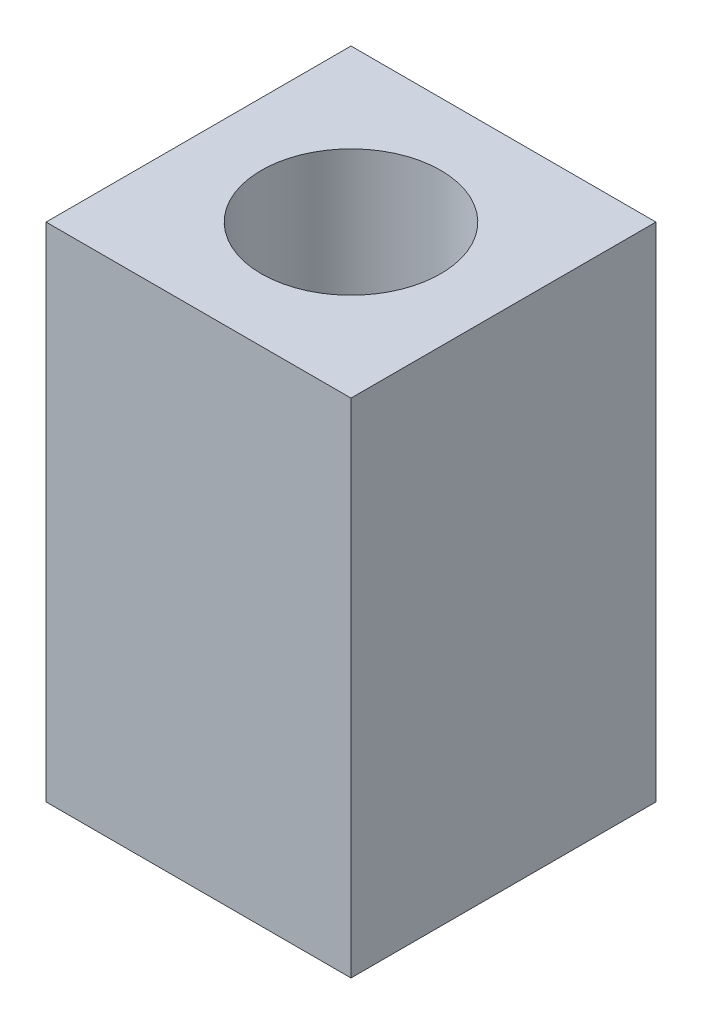
ISO-10303-21;
HEADER;
FILE_DESCRIPTION(('STEP AP214'),'2;1');
FILE_NAME('part.step','',(''),(''),'','','');
FILE_SCHEMA(('AUTOMOTIVE_DESIGN { 1 0 10303 214 1 1 1 1 }'));
ENDSEC;
DATA;
#1=APPLICATION_CONTEXT('core data for automotive mechanical design processes');
#2=APPLICATION_PROTOCOL_DEFINITION('international standard','automotive_design',2000,#1);
#3=PRODUCT_CONTEXT('',#1,'mechanical');
#4=PRODUCT('Part','Part','',(#3));
#5=PRODUCT_RELATED_PRODUCT_CATEGORY('part','',(#4));
#6=PRODUCT_DEFINITION_FORMATION('','',#4);
#7=PRODUCT_DEFINITION_CONTEXT('part definition',#1,'design');
#8=PRODUCT_DEFINITION('design','',#6,#7);
#9=PRODUCT_DEFINITION_SHAPE('','',#8);
#10=(LENGTH_UNIT() NAMED_UNIT(*) SI_UNIT(.MILLI.,.METRE.));
#11=(NAMED_UNIT(*) PLANE_ANGLE_UNIT() SI_UNIT($,.RADIAN.));
#12=(NAMED_UNIT(*) SI_UNIT($,.STERADIAN.) SOLID_ANGLE_UNIT());
#13=UNCERTAINTY_MEASURE_WITH_UNIT(LENGTH_MEASURE(1.E-05),#10,'distance_accuracy_value','');
#14=(GEOMETRIC_REPRESENTATION_CONTEXT(3) GLOBAL_UNCERTAINTY_ASSIGNED_CONTEXT((#13)) GLOBAL_UNIT_ASSIGNED_CONTEXT((#10,
#11,#12)) REPRESENTATION_CONTEXT('',''));
#15=CARTESIAN_POINT('',(0.,0.,0.));
#16=DIRECTION('',(0.,0.,1.));
#17=DIRECTION('',(1.,0.,0.));
#18=AXIS2_PLACEMENT_3D('',#15,#16,#17);
#19=CARTESIAN_POINT('',(-42.5,70.,-42.5));
#20=DIRECTION('',(1.,0.,0.));
#21=DIRECTION('',(0.,0.,-1.));
#22=AXIS2_PLACEMENT_3D('',#19,#20,#21);
#23=PLANE('',#22);
#24=DIRECTION('',(0.,0.,1.));
#25=VECTOR('',#24,1.);
#26=CARTESIAN_POINT('',(-42.5,-70.,-42.5));
#27=LINE('',#26,#25);
#28=CARTESIAN_POINT('',(-42.5,-70.,-42.5));
#29=VERTEX_POINT('',#28);
#30=CARTESIAN_POINT('',(-42.5,-70.,42.5));
#31=VERTEX_POINT('',#30);
#32=EDGE_CURVE('E107',#29,#31,#27,.T.);
#33=ORIENTED_EDGE('',*,*,#32,.T.);
#34=DIRECTION('',(0.,-1.,0.));
#35=VECTOR('',#34,1.);
#36=CARTESIAN_POINT('',(-42.5,70.,42.5));
#37=LINE('',#36,#35);
#38=CARTESIAN_POINT('',(-42.5,70.,42.5));
#39=VERTEX_POINT('',#38);
#40=EDGE_CURVE('E11',#39,#31,#37,.T.);
#41=ORIENTED_EDGE('',*,*,#40,.F.);
#42=DIRECTION('',(0.,0.,1.));
#43=VECTOR('',#42,1.);
#44=CARTESIAN_POINT('',(-42.5,70.,-42.5));
#45=LINE('',#44,#43);
#46=CARTESIAN_POINT('',(-42.5,70.,-42.5));
#47=VERTEX_POINT('',#46);
#48=EDGE_CURVE('E91',#47,#39,#45,.T.);
#49=ORIENTED_EDGE('',*,*,#48,.F.);
#50=DIRECTION('',(0.,-1.,0.));
#51=VECTOR('',#50,1.);
#52=CARTESIAN_POINT('',(-42.5,70.,-42.5));
#53=LINE('',#52,#51);
#54=EDGE_CURVE('E103',#47,#29,#53,.T.);
#55=ORIENTED_EDGE('',*,*,#54,.T.);
#56=EDGE_LOOP('',(#33,#41,#49,#55));
#57=FACE_BOUND('',#56,.T.);
#58=ADVANCED_FACE('F39',(#57),#23,.F.);
#59=CARTESIAN_POINT('',(-42.5,70.,42.5));
#60=DIRECTION('',(0.,0.,-1.));
#61=DIRECTION('',(-1.,0.,0.));
#62=AXIS2_PLACEMENT_3D('',#59,#60,#61);
#63=PLANE('',#62);
#64=DIRECTION('',(1.,0.,0.));
#65=VECTOR('',#64,1.);
#66=CARTESIAN_POINT('',(-42.5,-70.,42.5));
#67=LINE('',#66,#65);
#68=CARTESIAN_POINT('',(42.5,-70.,42.5));
#69=VERTEX_POINT('',#68);
#70=EDGE_CURVE('E96',#31,#69,#67,.T.);
#71=ORIENTED_EDGE('',*,*,#70,.T.);
#72=DIRECTION('',(0.,-1.,0.));
#73=VECTOR('',#72,1.);
#74=CARTESIAN_POINT('',(42.5,70.,42.5));
#75=LINE('',#74,#73);
#76=CARTESIAN_POINT('',(42.5,70.,42.5));
#77=VERTEX_POINT('',#76);
#78=EDGE_CURVE('E48',#77,#69,#75,.T.);
#79=ORIENTED_EDGE('',*,*,#78,.F.);
#80=DIRECTION('',(1.,0.,0.));
#81=VECTOR('',#80,1.);
#82=CARTESIAN_POINT('',(-42.5,70.,42.5));
#83=LINE('',#82,#81);
#84=EDGE_CURVE('E86',#39,#77,#83,.T.);
#85=ORIENTED_EDGE('',*,*,#84,.F.);
#86=ORIENTED_EDGE('',*,*,#40,.T.);
#87=EDGE_LOOP('',(#71,#79,#85,#86));
#88=FACE_BOUND('',#87,.T.);
#89=ADVANCED_FACE('F95',(#88),#63,.F.);
#90=CARTESIAN_POINT('',(42.5,70.,-42.5));
#91=DIRECTION('',(-1.,0.,0.));
#92=DIRECTION('',(0.,0.,1.));
#93=AXIS2_PLACEMENT_3D('',#90,#91,#92);
#94=PLANE('',#93);
#95=DIRECTION('',(0.,0.,-1.));
#96=VECTOR('',#95,1.);
#97=CARTESIAN_POINT('',(42.5,-70.,-42.5));
#98=LINE('',#97,#96);
#99=CARTESIAN_POINT('',(42.5,-70.,-42.5));
#100=VERTEX_POINT('',#99);
#101=EDGE_CURVE('E73',#69,#100,#98,.T.);
#102=ORIENTED_EDGE('',*,*,#101,.T.);
#103=DIRECTION('',(0.,-1.,0.));
#104=VECTOR('',#103,1.);
#105=CARTESIAN_POINT('',(42.5,70.,-42.5));
#106=LINE('',#105,#104);
#107=CARTESIAN_POINT('',(42.5,70.,-42.5));
#108=VERTEX_POINT('',#107);
#109=EDGE_CURVE('E98',#108,#100,#106,.T.);
#110=ORIENTED_EDGE('',*,*,#109,.F.);
#111=DIRECTION('',(0.,0.,-1.));
#112=VECTOR('',#111,1.);
#113=CARTESIAN_POINT('',(42.5,70.,-42.5));
#114=LINE('',#113,#112);
#115=EDGE_CURVE('E89',#77,#108,#114,.T.);
#116=ORIENTED_EDGE('',*,*,#115,.F.);
#117=ORIENTED_EDGE('',*,*,#78,.T.);
#118=EDGE_LOOP('',(#102,#110,#116,#117));
#119=FACE_BOUND('',#118,.T.);
#120=ADVANCED_FACE('F99',(#119),#94,.F.);
#121=CARTESIAN_POINT('',(-42.5,70.,-42.5));
#122=DIRECTION('',(0.,0.,1.));
#123=DIRECTION('',(1.,0.,0.));
#124=AXIS2_PLACEMENT_3D('',#121,#122,#123);
#125=PLANE('',#124);
#126=DIRECTION('',(-1.,0.,0.));
#127=VECTOR('',#126,1.);
#128=CARTESIAN_POINT('',(-42.5,-70.,-42.5));
#129=LINE('',#128,#127);
#130=EDGE_CURVE('E79',#100,#29,#129,.T.);
#131=ORIENTED_EDGE('',*,*,#130,.T.);
#132=ORIENTED_EDGE('',*,*,#54,.F.);
#133=DIRECTION('',(-1.,0.,0.));
#134=VECTOR('',#133,1.);
#135=CARTESIAN_POINT('',(-42.5,70.,-42.5));
#136=LINE('',#135,#134);
#137=EDGE_CURVE('E56',#108,#47,#136,.T.);
#138=ORIENTED_EDGE('',*,*,#137,.F.);
#139=ORIENTED_EDGE('',*,*,#109,.T.);
#140=EDGE_LOOP('',(#131,#132,#138,#139));
#141=FACE_BOUND('',#140,.T.);
#142=ADVANCED_FACE('F121',(#141),#125,.F.);
#143=CARTESIAN_POINT('',(0.,70.,0.));
#144=DIRECTION('',(0.,1.,0.));
#145=DIRECTION('',(0.,0.,1.));
#146=AXIS2_PLACEMENT_3D('',#143,#144,#145);
#147=PLANE('',#146);
#148=CARTESIAN_POINT('',(0.,70.,0.));
#149=DIRECTION('',(0.,1.,0.));
#150=DIRECTION('',(0.,0.,1.));
#151=AXIS2_PLACEMENT_3D('',#148,#149,#150);
#152=CIRCLE('',#151,25.);
#153=CARTESIAN_POINT('',(0.,70.,25.));
#154=VERTEX_POINT('',#153);
#155=EDGE_CURVE('E128',#154,#154,#152,.T.);
#156=ORIENTED_EDGE('',*,*,#155,.F.);
#157=EDGE_LOOP('',(#156));
#158=FACE_BOUND('',#157,.T.);
#159=ORIENTED_EDGE('',*,*,#48,.T.);
#160=ORIENTED_EDGE('',*,*,#84,.T.);
#161=ORIENTED_EDGE('',*,*,#115,.T.);
#162=ORIENTED_EDGE('',*,*,#137,.T.);
#163=EDGE_LOOP('',(#159,#160,#161,#162));
#164=FACE_BOUND('',#163,.T.);
#165=ADVANCED_FACE('F87',(#158,#164),#147,.T.);
#166=CARTESIAN_POINT('',(0.,-70.,0.));
#167=DIRECTION('',(0.,1.,0.));
#168=DIRECTION('',(0.,0.,1.));
#169=AXIS2_PLACEMENT_3D('',#166,#167,#168);
#170=PLANE('',#169);
#171=CARTESIAN_POINT('',(0.,-70.,0.));
#172=DIRECTION('',(0.,1.,0.));
#173=DIRECTION('',(0.,0.,1.));
#174=AXIS2_PLACEMENT_3D('',#171,#172,#173);
#175=CIRCLE('',#174,25.);
#176=CARTESIAN_POINT('',(0.,-70.,25.));
#177=VERTEX_POINT('',#176);
#178=EDGE_CURVE('E111',#177,#177,#175,.T.);
#179=ORIENTED_EDGE('',*,*,#178,.T.);
#180=EDGE_LOOP('',(#179));
#181=FACE_BOUND('',#180,.T.);
#182=ORIENTED_EDGE('',*,*,#32,.F.);
#183=ORIENTED_EDGE('',*,*,#130,.F.);
#184=ORIENTED_EDGE('',*,*,#101,.F.);
#185=ORIENTED_EDGE('',*,*,#70,.F.);
#186=EDGE_LOOP('',(#182,#183,#184,#185));
#187=FACE_BOUND('',#186,.T.);
#188=ADVANCED_FACE('F124',(#181,#187),#170,.F.);
#189=CARTESIAN_POINT('',(0.,-70.,0.));
#190=DIRECTION('',(0.,1.,0.));
#191=DIRECTION('',(0.,0.,1.));
#192=AXIS2_PLACEMENT_3D('',#189,#190,#191);
#193=CYLINDRICAL_SURFACE('',#192,25.);
#194=ORIENTED_EDGE('',*,*,#178,.F.);
#195=EDGE_LOOP('',(#194));
#196=FACE_BOUND('',#195,.T.);
#197=ORIENTED_EDGE('',*,*,#155,.T.);
#198=EDGE_LOOP('',(#197));
#199=FACE_BOUND('',#198,.T.);
#200=ADVANCED_FACE('F137',(#196,#199),#193,.F.);
#201=CLOSED_SHELL('',(#58,#89,#120,#142,#165,#188,#200));
#202=MANIFOLD_SOLID_BREP('B2',#201);
#203=ADVANCED_BREP_SHAPE_REPRESENTATION('',(#18,#202),#14);
#204=SHAPE_DEFINITION_REPRESENTATION(#9,#203);
ENDSEC;
END-ISO-10303-21;
